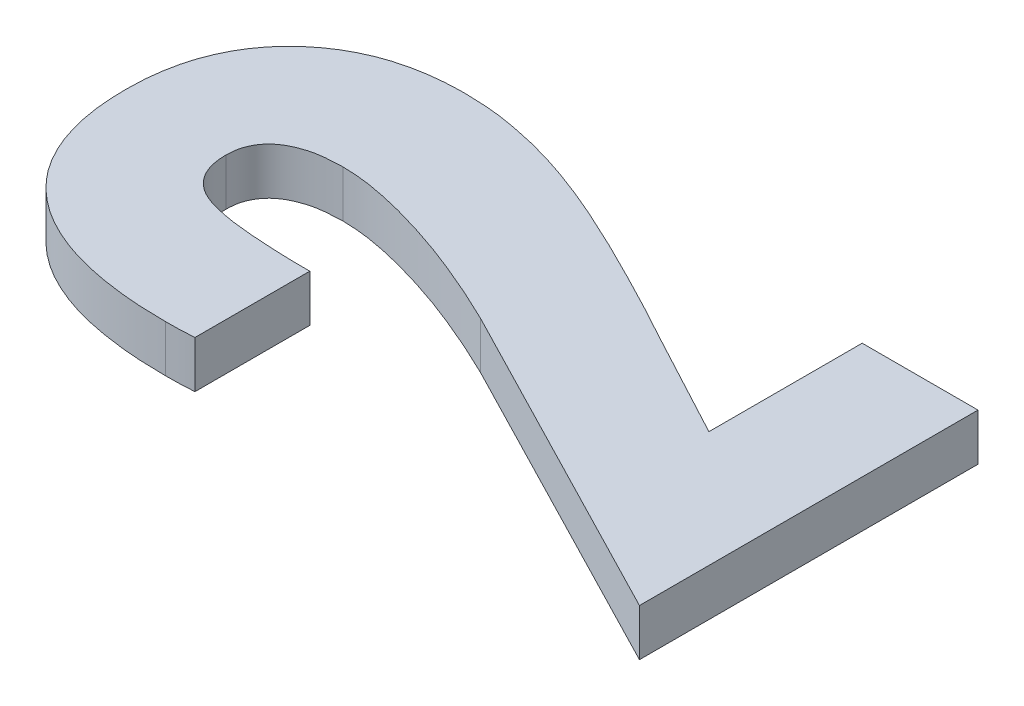
ISO-10303-21;
HEADER;
FILE_DESCRIPTION(('STEP AP214'),'2;1');
FILE_NAME('part.step','',(''),(''),'','','');
FILE_SCHEMA(('AUTOMOTIVE_DESIGN { 1 0 10303 214 1 1 1 1 }'));
ENDSEC;
DATA;
#1=APPLICATION_CONTEXT('core data for automotive mechanical design processes');
#2=APPLICATION_PROTOCOL_DEFINITION('international standard','automotive_design',2000,#1);
#3=PRODUCT_CONTEXT('',#1,'mechanical');
#4=PRODUCT('Part','Part','',(#3));
#5=PRODUCT_RELATED_PRODUCT_CATEGORY('part','',(#4));
#6=PRODUCT_DEFINITION_FORMATION('','',#4);
#7=PRODUCT_DEFINITION_CONTEXT('part definition',#1,'design');
#8=PRODUCT_DEFINITION('design','',#6,#7);
#9=PRODUCT_DEFINITION_SHAPE('','',#8);
#10=(LENGTH_UNIT() NAMED_UNIT(*) SI_UNIT(.MILLI.,.METRE.));
#11=(NAMED_UNIT(*) PLANE_ANGLE_UNIT() SI_UNIT($,.RADIAN.));
#12=(NAMED_UNIT(*) SI_UNIT($,.STERADIAN.) SOLID_ANGLE_UNIT());
#13=UNCERTAINTY_MEASURE_WITH_UNIT(LENGTH_MEASURE(1.E-05),#10,'distance_accuracy_value','');
#14=(GEOMETRIC_REPRESENTATION_CONTEXT(3) GLOBAL_UNCERTAINTY_ASSIGNED_CONTEXT((#13)) GLOBAL_UNIT_ASSIGNED_CONTEXT((#10,
#11,#12)) REPRESENTATION_CONTEXT('',''));
#15=CARTESIAN_POINT('',(0.,0.,0.));
#16=DIRECTION('',(0.,0.,1.));
#17=DIRECTION('',(1.,0.,0.));
#18=AXIS2_PLACEMENT_3D('',#15,#16,#17);
#19=CARTESIAN_POINT('',(2.55,2.9956,2.4466233766234));
#20=DIRECTION('',(1.,0.,0.));
#21=DIRECTION('',(0.,-1.,0.));
#22=AXIS2_PLACEMENT_3D('',#19,#20,#21);
#23=PLANE('',#22);
#24=DIRECTION('',(0.,0.,1.));
#25=VECTOR('',#24,1.);
#26=CARTESIAN_POINT('',(2.55,2.9306,2.4466233766234));
#27=LINE('',#26,#25);
#28=CARTESIAN_POINT('',(2.55,2.9306,2.4466233766234));
#29=VERTEX_POINT('',#28);
#30=CARTESIAN_POINT('',(2.55,2.9306,2.9154545454545));
#31=VERTEX_POINT('',#30);
#32=EDGE_CURVE('E11',#29,#31,#27,.T.);
#33=ORIENTED_EDGE('',*,*,#32,.F.);
#34=DIRECTION('',(0.,-1.,0.));
#35=VECTOR('',#34,1.);
#36=CARTESIAN_POINT('',(2.55,2.9956,2.4466233766234));
#37=LINE('',#36,#35);
#38=CARTESIAN_POINT('',(2.55,2.9956,2.4466233766234));
#39=VERTEX_POINT('',#38);
#40=EDGE_CURVE('E24',#39,#29,#37,.T.);
#41=ORIENTED_EDGE('',*,*,#40,.F.);
#42=DIRECTION('',(0.,0.,1.));
#43=VECTOR('',#42,1.);
#44=CARTESIAN_POINT('',(2.55,2.9956,2.4466233766234));
#45=LINE('',#44,#43);
#46=CARTESIAN_POINT('',(2.55,2.9956,2.9154545454545));
#47=VERTEX_POINT('',#46);
#48=EDGE_CURVE('E294',#39,#47,#45,.T.);
#49=ORIENTED_EDGE('',*,*,#48,.T.);
#50=DIRECTION('',(0.,-1.,0.));
#51=VECTOR('',#50,1.);
#52=CARTESIAN_POINT('',(2.55,2.9956,2.9154545454545));
#53=LINE('',#52,#51);
#54=EDGE_CURVE('E132',#47,#31,#53,.T.);
#55=ORIENTED_EDGE('',*,*,#54,.T.);
#56=EDGE_LOOP('',(#33,#41,#49,#55));
#57=FACE_BOUND('',#56,.T.);
#58=ADVANCED_FACE('F17',(#57),#23,.T.);
#59=CARTESIAN_POINT('',(2.3896103896104,2.9956,2.4466233766234));
#60=DIRECTION('',(0.,0.,-1.));
#61=DIRECTION('',(0.,1.,0.));
#62=AXIS2_PLACEMENT_3D('',#59,#60,#61);
#63=PLANE('',#62);
#64=DIRECTION('',(1.,0.,0.));
#65=VECTOR('',#64,1.);
#66=CARTESIAN_POINT('',(2.3896103896104,2.9306,2.4466233766234));
#67=LINE('',#66,#65);
#68=CARTESIAN_POINT('',(2.3896103896104,2.9306,2.4466233766234));
#69=VERTEX_POINT('',#68);
#70=EDGE_CURVE('E291',#69,#29,#67,.T.);
#71=ORIENTED_EDGE('',*,*,#70,.F.);
#72=DIRECTION('',(0.,-1.,0.));
#73=VECTOR('',#72,1.);
#74=CARTESIAN_POINT('',(2.3896103896104,2.9956,2.4466233766234));
#75=LINE('',#74,#73);
#76=CARTESIAN_POINT('',(2.3896103896104,2.9956,2.4466233766234));
#77=VERTEX_POINT('',#76);
#78=EDGE_CURVE('E288',#77,#69,#75,.T.);
#79=ORIENTED_EDGE('',*,*,#78,.F.);
#80=DIRECTION('',(1.,0.,0.));
#81=VECTOR('',#80,1.);
#82=CARTESIAN_POINT('',(2.3896103896104,2.9956,2.4466233766234));
#83=LINE('',#82,#81);
#84=EDGE_CURVE('E285',#77,#39,#83,.T.);
#85=ORIENTED_EDGE('',*,*,#84,.T.);
#86=ORIENTED_EDGE('',*,*,#40,.T.);
#87=EDGE_LOOP('',(#71,#79,#85,#86));
#88=FACE_BOUND('',#87,.T.);
#89=ADVANCED_FACE('F296',(#88),#63,.T.);
#90=CARTESIAN_POINT('',(2.3896103896104,2.9956,2.658869724026));
#91=DIRECTION('',(-1.,0.,0.));
#92=DIRECTION('',(0.,1.,0.));
#93=AXIS2_PLACEMENT_3D('',#90,#91,#92);
#94=PLANE('',#93);
#95=DIRECTION('',(0.,0.,-1.));
#96=VECTOR('',#95,1.);
#97=CARTESIAN_POINT('',(2.3896103896104,2.9306,2.658869724026));
#98=LINE('',#97,#96);
#99=CARTESIAN_POINT('',(2.3896103896104,2.9306,2.658869724026));
#100=VERTEX_POINT('',#99);
#101=EDGE_CURVE('E282',#100,#69,#98,.T.);
#102=ORIENTED_EDGE('',*,*,#101,.F.);
#103=DIRECTION('',(0.,-1.,0.));
#104=VECTOR('',#103,1.);
#105=CARTESIAN_POINT('',(2.3896103896104,2.9956,2.658869724026));
#106=LINE('',#105,#104);
#107=CARTESIAN_POINT('',(2.3896103896104,2.9956,2.658869724026));
#108=VERTEX_POINT('',#107);
#109=EDGE_CURVE('E279',#108,#100,#106,.T.);
#110=ORIENTED_EDGE('',*,*,#109,.F.);
#111=DIRECTION('',(0.,0.,-1.));
#112=VECTOR('',#111,1.);
#113=CARTESIAN_POINT('',(2.3896103896104,2.9956,2.658869724026));
#114=LINE('',#113,#112);
#115=EDGE_CURVE('E276',#108,#77,#114,.T.);
#116=ORIENTED_EDGE('',*,*,#115,.T.);
#117=ORIENTED_EDGE('',*,*,#78,.T.);
#118=EDGE_LOOP('',(#102,#110,#116,#117));
#119=FACE_BOUND('',#118,.T.);
#120=ADVANCED_FACE('F300',(#119),#94,.T.);
#121=CARTESIAN_POINT('',(2.2411728896104,2.9956,2.5794460227273));
#122=DIRECTION('',(0.471776481503363,0.,-0.88171818145046));
#123=DIRECTION('',(-0.88171818145046,0.,-0.471776481503363));
#124=AXIS2_PLACEMENT_3D('',#121,#122,#123);
#125=PLANE('',#124);
#126=DIRECTION('',(0.88171818145046,0.,0.471776481503363));
#127=VECTOR('',#126,1.);
#128=CARTESIAN_POINT('',(2.2411728896104,2.9306,2.5794460227273));
#129=LINE('',#128,#127);
#130=CARTESIAN_POINT('',(2.2411728896104,2.9306,2.5794460227273));
#131=VERTEX_POINT('',#130);
#132=EDGE_CURVE('E273',#131,#100,#129,.T.);
#133=ORIENTED_EDGE('',*,*,#132,.F.);
#134=DIRECTION('',(0.,-1.,0.));
#135=VECTOR('',#134,1.);
#136=CARTESIAN_POINT('',(2.2411728896104,2.9956,2.5794460227273));
#137=LINE('',#136,#135);
#138=CARTESIAN_POINT('',(2.2411728896104,2.9956,2.5794460227273));
#139=VERTEX_POINT('',#138);
#140=EDGE_CURVE('E270',#139,#131,#137,.T.);
#141=ORIENTED_EDGE('',*,*,#140,.F.);
#142=DIRECTION('',(0.88171818145046,0.,0.471776481503363));
#143=VECTOR('',#142,1.);
#144=CARTESIAN_POINT('',(2.2411728896104,2.9956,2.5794460227273));
#145=LINE('',#144,#143);
#146=EDGE_CURVE('E264',#139,#108,#145,.T.);
#147=ORIENTED_EDGE('',*,*,#146,.T.);
#148=ORIENTED_EDGE('',*,*,#109,.T.);
#149=EDGE_LOOP('',(#133,#141,#147,#148));
#150=FACE_BOUND('',#149,.T.);
#151=ADVANCED_FACE('F303',(#150),#125,.T.);
#152=CARTESIAN_POINT('',(1.815137987013,2.9956,2.4219480519481));
#153=CARTESIAN_POINT('',(1.815137987013,2.9306,2.4219480519481));
#154=CARTESIAN_POINT('',(1.8280140387404,2.9956,2.4223085834457));
#155=CARTESIAN_POINT('',(1.8280140387404,2.9306,2.4223085834457));
#156=CARTESIAN_POINT('',(1.8545489463179,2.9956,2.423051565081));
#157=CARTESIAN_POINT('',(1.8545489463179,2.9306,2.423051565081));
#158=CARTESIAN_POINT('',(1.8951400305445,2.9956,2.4297636555094));
#159=CARTESIAN_POINT('',(1.8951400305445,2.9306,2.4297636555094));
#160=CARTESIAN_POINT('',(1.9377170777586,2.9956,2.4397144743967));
#161=CARTESIAN_POINT('',(1.9377170777586,2.9306,2.4397144743967));
#162=CARTESIAN_POINT('',(1.9744361030969,2.9956,2.4516947987664));
#163=CARTESIAN_POINT('',(1.9744361030969,2.9306,2.4516947987664));
#164=CARTESIAN_POINT('',(2.0057829344742,2.9956,2.46367110546));
#165=CARTESIAN_POINT('',(2.0057829344742,2.9306,2.46367110546));
#166=CARTESIAN_POINT('',(2.0322801080516,2.9956,2.4744195268402));
#167=CARTESIAN_POINT('',(2.0322801080516,2.9306,2.4744195268402));
#168=CARTESIAN_POINT('',(2.0610420074567,2.9956,2.4874367367209));
#169=CARTESIAN_POINT('',(2.0610420074567,2.9306,2.4874367367209));
#170=CARTESIAN_POINT('',(2.0923666821898,2.9956,2.5020961937868));
#171=CARTESIAN_POINT('',(2.0923666821898,2.9306,2.5020961937868));
#172=CARTESIAN_POINT('',(2.1260967230946,2.9956,2.5187016691765));
#173=CARTESIAN_POINT('',(2.1260967230946,2.9306,2.5187016691765));
#174=CARTESIAN_POINT('',(2.1622698522993,2.9956,2.5372828202527));
#175=CARTESIAN_POINT('',(2.1622698522993,2.9306,2.5372828202527));
#176=CARTESIAN_POINT('',(2.2010943975891,2.9956,2.5573944884237));
#177=CARTESIAN_POINT('',(2.2010943975891,2.9306,2.5573944884237));
#178=CARTESIAN_POINT('',(2.2275175139791,2.9956,2.5719327164881));
#179=CARTESIAN_POINT('',(2.2275175139791,2.9306,2.5719327164881));
#180=CARTESIAN_POINT('',(2.2411728896104,2.9956,2.5794460227273));
#181=CARTESIAN_POINT('',(2.2411728896104,2.9306,2.5794460227273));
#182=B_SPLINE_SURFACE_WITH_KNOTS('',3,1,((#152,#153),(#154,#155),(#156,#157),(#158,#159),(#160,
#161),(#162,#163),(#164,#165),(#166,#167),(#168,#169),(#170,#171),(#172,#173),(#174,#175),(#176,
#177),(#178,#179),(#180,#181)),.UNSPECIFIED.,.F.,.F.,.F.,(4,1,1,1,1,1,1,1,1,1,1,1,4),(2,2),(0.,
0.0841535323354009,0.173423208458468,0.268424084711057,0.369959448801613,0.425687178443032,
0.487884515726795,0.556923367619781,0.632122153306125,0.714065166825065,0.802775202710945,
0.898074903389879,1.),(0.,1.),.UNSPECIFIED.);
#183=CARTESIAN_POINT('',(1.815137987013,2.9306,2.4219480519481));
#184=CARTESIAN_POINT('',(1.8280140387404,2.9306,2.4223085834457));
#185=CARTESIAN_POINT('',(1.8545489463179,2.9306,2.423051565081));
#186=CARTESIAN_POINT('',(1.8951400305445,2.9306,2.4297636555094));
#187=CARTESIAN_POINT('',(1.9377170777586,2.9306,2.4397144743967));
#188=CARTESIAN_POINT('',(1.9744361030969,2.9306,2.4516947987664));
#189=CARTESIAN_POINT('',(2.0057829344742,2.9306,2.46367110546));
#190=CARTESIAN_POINT('',(2.0322801080516,2.9306,2.4744195268402));
#191=CARTESIAN_POINT('',(2.0610420074567,2.9306,2.4874367367209));
#192=CARTESIAN_POINT('',(2.0923666821898,2.9306,2.5020961937868));
#193=CARTESIAN_POINT('',(2.1260967230946,2.9306,2.5187016691765));
#194=CARTESIAN_POINT('',(2.1622698522993,2.9306,2.5372828202527));
#195=CARTESIAN_POINT('',(2.2010943975891,2.9306,2.5573944884237));
#196=CARTESIAN_POINT('',(2.2275175139791,2.9306,2.5719327164881));
#197=CARTESIAN_POINT('',(2.2411728896104,2.9306,2.5794460227273));
#198=B_SPLINE_CURVE_WITH_KNOTS('',3,(#183,#184,#185,#186,#187,#188,#189,#190,#191,#192,#193,
#194,#195,#196,#197),.UNSPECIFIED.,.F.,.F.,(4,1,1,1,1,1,1,1,1,1,1,1,4),(0.,0.0841535323354009,
0.173423208458468,0.268424084711057,0.369959448801613,0.425687178443032,0.487884515726795,
0.556923367619781,0.632122153306125,0.714065166825065,0.802775202710945,0.898074903389879,1.),.UNSPECIFIED.);
#199=CARTESIAN_POINT('',(1.815137987013,2.9306,2.4219480519481));
#200=VERTEX_POINT('',#199);
#201=EDGE_CURVE('E259',#200,#131,#198,.T.);
#202=DIRECTION('',(0.,-1.,0.));
#203=VECTOR('',#202,1.);
#204=CARTESIAN_POINT('',(1.815137987013,2.9956,2.4219480519481));
#205=LINE('',#204,#203);
#206=CARTESIAN_POINT('',(1.815137987013,2.9956,2.4219480519481));
#207=VERTEX_POINT('',#206);
#208=EDGE_CURVE('E253',#207,#200,#205,.T.);
#209=CARTESIAN_POINT('',(1.815137987013,2.9956,2.4219480519481));
#210=CARTESIAN_POINT('',(1.8280140387404,2.9956,2.4223085834457));
#211=CARTESIAN_POINT('',(1.8545489463179,2.9956,2.423051565081));
#212=CARTESIAN_POINT('',(1.8951400305445,2.9956,2.4297636555094));
#213=CARTESIAN_POINT('',(1.9377170777586,2.9956,2.4397144743967));
#214=CARTESIAN_POINT('',(1.9744361030969,2.9956,2.4516947987664));
#215=CARTESIAN_POINT('',(2.0057829344742,2.9956,2.46367110546));
#216=CARTESIAN_POINT('',(2.0322801080516,2.9956,2.4744195268402));
#217=CARTESIAN_POINT('',(2.0610420074567,2.9956,2.4874367367209));
#218=CARTESIAN_POINT('',(2.0923666821898,2.9956,2.5020961937868));
#219=CARTESIAN_POINT('',(2.1260967230946,2.9956,2.5187016691765));
#220=CARTESIAN_POINT('',(2.1622698522993,2.9956,2.5372828202527));
#221=CARTESIAN_POINT('',(2.2010943975891,2.9956,2.5573944884237));
#222=CARTESIAN_POINT('',(2.2275175139791,2.9956,2.5719327164881));
#223=CARTESIAN_POINT('',(2.2411728896104,2.9956,2.5794460227273));
#224=B_SPLINE_CURVE_WITH_KNOTS('',3,(#209,#210,#211,#212,#213,#214,#215,#216,#217,#218,#219,
#220,#221,#222,#223),.UNSPECIFIED.,.F.,.F.,(4,1,1,1,1,1,1,1,1,1,1,1,4),(0.,0.0841535323354009,
0.173423208458468,0.268424084711057,0.369959448801613,0.425687178443032,0.487884515726795,
0.556923367619781,0.632122153306125,0.714065166825065,0.802775202710945,0.898074903389879,1.),.UNSPECIFIED.);
#225=EDGE_CURVE('E245',#207,#139,#224,.T.);
#226=ORIENTED_EDGE('',*,*,#201,.F.);
#227=ORIENTED_EDGE('',*,*,#208,.F.);
#228=ORIENTED_EDGE('',*,*,#225,.T.);
#229=ORIENTED_EDGE('',*,*,#140,.T.);
#230=EDGE_LOOP('',(#226,#227,#228,#229));
#231=FACE_BOUND('',#230,.T.);
#232=ADVANCED_FACE('F308',(#231),#182,.T.);
#233=CARTESIAN_POINT('',(1.5753246753247,2.9956,2.651737012987));
#234=CARTESIAN_POINT('',(1.5753246753247,2.9306,2.651737012987));
#235=CARTESIAN_POINT('',(1.5754767160002,2.9956,2.6431149631171));
#236=CARTESIAN_POINT('',(1.5754767160002,2.9306,2.6431149631171));
#237=CARTESIAN_POINT('',(1.5757727681102,2.9956,2.6263261922921));
#238=CARTESIAN_POINT('',(1.5757727681102,2.9306,2.6263261922921));
#239=CARTESIAN_POINT('',(1.5790385454388,2.9956,2.6018329970535));
#240=CARTESIAN_POINT('',(1.5790385454388,2.9306,2.6018329970535));
#241=CARTESIAN_POINT('',(1.5838665891994,2.9956,2.5786655962364));
#242=CARTESIAN_POINT('',(1.5838665891994,2.9306,2.5786655962364));
#243=CARTESIAN_POINT('',(1.5911231227219,2.9956,2.5569392287587));
#244=CARTESIAN_POINT('',(1.5911231227219,2.9306,2.5569392287587));
#245=CARTESIAN_POINT('',(1.6001456439086,2.9956,2.5365117809013));
#246=CARTESIAN_POINT('',(1.6001456439086,2.9306,2.5365117809013));
#247=CARTESIAN_POINT('',(1.6114393844046,2.9956,2.5175635955669));
#248=CARTESIAN_POINT('',(1.6114393844046,2.9306,2.5175635955669));
#249=CARTESIAN_POINT('',(1.6246111006042,2.9956,2.4998596277387));
#250=CARTESIAN_POINT('',(1.6246111006042,2.9306,2.4998596277387));
#251=CARTESIAN_POINT('',(1.639822753678,2.9956,2.4836973602856));
#252=CARTESIAN_POINT('',(1.639822753678,2.9306,2.4836973602856));
#253=CARTESIAN_POINT('',(1.6568622751586,2.9956,2.4693034324471));
#254=CARTESIAN_POINT('',(1.6568622751586,2.9306,2.4693034324471));
#255=CARTESIAN_POINT('',(1.6751430046056,2.9956,2.4564363152045));
#256=CARTESIAN_POINT('',(1.6751430046056,2.9306,2.4564363152045));
#257=CARTESIAN_POINT('',(1.6950906739051,2.9956,2.4458425147271));
#258=CARTESIAN_POINT('',(1.6950906739051,2.9306,2.4458425147271));
#259=CARTESIAN_POINT('',(1.7162694599253,2.9956,2.4368942390099));
#260=CARTESIAN_POINT('',(1.7162694599253,2.9306,2.4368942390099));
#261=CARTESIAN_POINT('',(1.7390491100072,2.9956,2.4301819416341));
#262=CARTESIAN_POINT('',(1.7390491100072,2.9306,2.4301819416341));
#263=CARTESIAN_POINT('',(1.7631830684132,2.9956,2.4254211537877));
#264=CARTESIAN_POINT('',(1.7631830684132,2.9306,2.4254211537877));
#265=CARTESIAN_POINT('',(1.7887188613873,2.9956,2.4224680546979));
#266=CARTESIAN_POINT('',(1.7887188613873,2.9306,2.4224680546979));
#267=CARTESIAN_POINT('',(1.8061979110027,2.9956,2.4221240178061));
#268=CARTESIAN_POINT('',(1.8061979110027,2.9306,2.4221240178061));
#269=CARTESIAN_POINT('',(1.815137987013,2.9956,2.4219480519481));
#270=CARTESIAN_POINT('',(1.815137987013,2.9306,2.4219480519481));
#271=B_SPLINE_SURFACE_WITH_KNOTS('',3,1,((#233,#234),(#235,#236),(#237,#238),(#239,#240),(#241,
#242),(#243,#244),(#245,#246),(#247,#248),(#249,#250),(#251,#252),(#253,#254),(#255,#256),(#257,
#258),(#259,#260),(#261,#262),(#263,#264),(#265,#266),(#267,#268),(#269,#270)),.UNSPECIFIED.,
.F.,.F.,.F.,(4,1,1,1,1,1,1,1,1,1,1,1,1,1,1,1,4),(2,2),(0.,0.0688496335754191,0.134063330289372,
0.197106461741571,0.257669144546347,0.316735514046816,0.37520526091284,0.433532808566138,
0.492739602849354,0.552106475877159,0.611499986749421,0.670999929743259,0.732218533488547,
0.794922033348914,0.860373803317353,0.928584857938967,1.),(0.,1.),.UNSPECIFIED.);
#272=CARTESIAN_POINT('',(1.5753246753247,2.9306,2.651737012987));
#273=CARTESIAN_POINT('',(1.5754767160002,2.9306,2.6431149631171));
#274=CARTESIAN_POINT('',(1.5757727681102,2.9306,2.6263261922921));
#275=CARTESIAN_POINT('',(1.5790385454388,2.9306,2.6018329970535));
#276=CARTESIAN_POINT('',(1.5838665891994,2.9306,2.5786655962364));
#277=CARTESIAN_POINT('',(1.5911231227219,2.9306,2.5569392287587));
#278=CARTESIAN_POINT('',(1.6001456439086,2.9306,2.5365117809013));
#279=CARTESIAN_POINT('',(1.6114393844046,2.9306,2.5175635955669));
#280=CARTESIAN_POINT('',(1.6246111006042,2.9306,2.4998596277387));
#281=CARTESIAN_POINT('',(1.639822753678,2.9306,2.4836973602856));
#282=CARTESIAN_POINT('',(1.6568622751586,2.9306,2.4693034324471));
#283=CARTESIAN_POINT('',(1.6751430046056,2.9306,2.4564363152045));
#284=CARTESIAN_POINT('',(1.6950906739051,2.9306,2.4458425147271));
#285=CARTESIAN_POINT('',(1.7162694599253,2.9306,2.4368942390099));
#286=CARTESIAN_POINT('',(1.7390491100072,2.9306,2.4301819416341));
#287=CARTESIAN_POINT('',(1.7631830684132,2.9306,2.4254211537877));
#288=CARTESIAN_POINT('',(1.7887188613873,2.9306,2.4224680546979));
#289=CARTESIAN_POINT('',(1.8061979110027,2.9306,2.4221240178061));
#290=CARTESIAN_POINT('',(1.815137987013,2.9306,2.4219480519481));
#291=B_SPLINE_CURVE_WITH_KNOTS('',3,(#272,#273,#274,#275,#276,#277,#278,#279,#280,#281,#282,
#283,#284,#285,#286,#287,#288,#289,#290),.UNSPECIFIED.,.F.,.F.,(4,1,1,1,1,1,1,1,1,1,1,1,1,1,1,1,
4),(0.,0.0688496335754191,0.134063330289372,0.197106461741571,0.257669144546347,
0.316735514046816,0.37520526091284,0.433532808566138,0.492739602849354,0.552106475877159,
0.611499986749421,0.670999929743259,0.732218533488547,0.794922033348914,0.860373803317353,
0.928584857938967,1.),.UNSPECIFIED.);
#292=CARTESIAN_POINT('',(1.5753246753247,2.9306,2.651737012987));
#293=VERTEX_POINT('',#292);
#294=EDGE_CURVE('E240',#293,#200,#291,.T.);
#295=DIRECTION('',(0.,-1.,0.));
#296=VECTOR('',#295,1.);
#297=CARTESIAN_POINT('',(1.5753246753247,2.9956,2.651737012987));
#298=LINE('',#297,#296);
#299=CARTESIAN_POINT('',(1.5753246753247,2.9956,2.651737012987));
#300=VERTEX_POINT('',#299);
#301=EDGE_CURVE('E234',#300,#293,#298,.T.);
#302=CARTESIAN_POINT('',(1.5753246753247,2.9956,2.651737012987));
#303=CARTESIAN_POINT('',(1.5754767160002,2.9956,2.6431149631171));
#304=CARTESIAN_POINT('',(1.5757727681102,2.9956,2.6263261922921));
#305=CARTESIAN_POINT('',(1.5790385454388,2.9956,2.6018329970535));
#306=CARTESIAN_POINT('',(1.5838665891994,2.9956,2.5786655962364));
#307=CARTESIAN_POINT('',(1.5911231227219,2.9956,2.5569392287587));
#308=CARTESIAN_POINT('',(1.6001456439086,2.9956,2.5365117809013));
#309=CARTESIAN_POINT('',(1.6114393844046,2.9956,2.5175635955669));
#310=CARTESIAN_POINT('',(1.6246111006042,2.9956,2.4998596277387));
#311=CARTESIAN_POINT('',(1.639822753678,2.9956,2.4836973602856));
#312=CARTESIAN_POINT('',(1.6568622751586,2.9956,2.4693034324471));
#313=CARTESIAN_POINT('',(1.6751430046056,2.9956,2.4564363152045));
#314=CARTESIAN_POINT('',(1.6950906739051,2.9956,2.4458425147271));
#315=CARTESIAN_POINT('',(1.7162694599253,2.9956,2.4368942390099));
#316=CARTESIAN_POINT('',(1.7390491100072,2.9956,2.4301819416341));
#317=CARTESIAN_POINT('',(1.7631830684132,2.9956,2.4254211537877));
#318=CARTESIAN_POINT('',(1.7887188613873,2.9956,2.4224680546979));
#319=CARTESIAN_POINT('',(1.8061979110027,2.9956,2.4221240178061));
#320=CARTESIAN_POINT('',(1.815137987013,2.9956,2.4219480519481));
#321=B_SPLINE_CURVE_WITH_KNOTS('',3,(#302,#303,#304,#305,#306,#307,#308,#309,#310,#311,#312,
#313,#314,#315,#316,#317,#318,#319,#320),.UNSPECIFIED.,.F.,.F.,(4,1,1,1,1,1,1,1,1,1,1,1,1,1,1,1,
4),(0.,0.0688496335754191,0.134063330289372,0.197106461741571,0.257669144546347,
0.316735514046816,0.37520526091284,0.433532808566138,0.492739602849354,0.552106475877159,
0.611499986749421,0.670999929743259,0.732218533488547,0.794922033348914,0.860373803317353,
0.928584857938967,1.),.UNSPECIFIED.);
#322=EDGE_CURVE('E226',#300,#207,#321,.T.);
#323=ORIENTED_EDGE('',*,*,#294,.F.);
#324=ORIENTED_EDGE('',*,*,#301,.F.);
#325=ORIENTED_EDGE('',*,*,#322,.T.);
#326=ORIENTED_EDGE('',*,*,#208,.T.);
#327=EDGE_LOOP('',(#323,#324,#325,#326));
#328=FACE_BOUND('',#327,.T.);
#329=ADVANCED_FACE('F310',(#328),#271,.T.);
#330=CARTESIAN_POINT('',(1.8812601461039,2.9956,2.9031168831169));
#331=CARTESIAN_POINT('',(1.8812601461039,2.9306,2.9031168831169));
#332=CARTESIAN_POINT('',(1.8691079834718,2.9956,2.9029617455148));
#333=CARTESIAN_POINT('',(1.8691079834718,2.9306,2.9029617455148));
#334=CARTESIAN_POINT('',(1.845532817911,2.9956,2.902660778949));
#335=CARTESIAN_POINT('',(1.845532817911,2.9306,2.902660778949));
#336=CARTESIAN_POINT('',(1.8113410417312,2.9956,2.8994923796882));
#337=CARTESIAN_POINT('',(1.8113410417312,2.9306,2.8994923796882));
#338=CARTESIAN_POINT('',(1.7793902501637,2.9956,2.894529266419));
#339=CARTESIAN_POINT('',(1.7793902501637,2.9306,2.894529266419));
#340=CARTESIAN_POINT('',(1.7496164763615,2.9956,2.8877125692327));
#341=CARTESIAN_POINT('',(1.7496164763615,2.9306,2.8877125692327));
#342=CARTESIAN_POINT('',(1.7221349606599,2.9956,2.8786394693431));
#343=CARTESIAN_POINT('',(1.7221349606599,2.9306,2.8786394693431));
#344=CARTESIAN_POINT('',(1.6968969235994,2.9956,2.8676059626757));
#345=CARTESIAN_POINT('',(1.6968969235994,2.9306,2.8676059626757));
#346=CARTESIAN_POINT('',(1.6737722742615,2.9956,2.8547458392355));
#347=CARTESIAN_POINT('',(1.6737722742615,2.9306,2.8547458392355));
#348=CARTESIAN_POINT('',(1.6530415117925,2.9956,2.839608320558));
#349=CARTESIAN_POINT('',(1.6530415117925,2.9306,2.839608320558));
#350=CARTESIAN_POINT('',(1.6346458607338,2.9956,2.8226128305528));
#351=CARTESIAN_POINT('',(1.6346458607338,2.9306,2.8226128305528));
#352=CARTESIAN_POINT('',(1.6186275106082,2.9956,2.8037643638593));
#353=CARTESIAN_POINT('',(1.6186275106082,2.9306,2.8037643638593));
#354=CARTESIAN_POINT('',(1.6052772996688,2.9956,2.7828987075812));
#355=CARTESIAN_POINT('',(1.6052772996688,2.9306,2.7828987075812));
#356=CARTESIAN_POINT('',(1.59423533543,2.9956,2.7602707633692));
#357=CARTESIAN_POINT('',(1.59423533543,2.9306,2.7602707633692));
#358=CARTESIAN_POINT('',(1.5857687040258,2.9956,2.7357152037606));
#359=CARTESIAN_POINT('',(1.5857687040258,2.9306,2.7357152037606));
#360=CARTESIAN_POINT('',(1.5796059607806,2.9956,2.7093730989925));
#361=CARTESIAN_POINT('',(1.5796059607806,2.9306,2.7093730989925));
#362=CARTESIAN_POINT('',(1.5759065503809,2.9956,2.681144345751));
#363=CARTESIAN_POINT('',(1.5759065503809,2.9306,2.681144345751));
#364=CARTESIAN_POINT('',(1.5755219768012,2.9956,2.6617084151191));
#365=CARTESIAN_POINT('',(1.5755219768012,2.9306,2.6617084151191));
#366=CARTESIAN_POINT('',(1.5753246753247,2.9956,2.651737012987));
#367=CARTESIAN_POINT('',(1.5753246753247,2.9306,2.651737012987));
#368=B_SPLINE_SURFACE_WITH_KNOTS('',3,1,((#330,#331),(#332,#333),(#334,#335),(#336,#337),(#338,
#339),(#340,#341),(#342,#343),(#344,#345),(#346,#347),(#348,#349),(#350,#351),(#352,#353),(#354,
#355),(#356,#357),(#358,#359),(#360,#361),(#362,#363),(#364,#365),(#366,#367)),.UNSPECIFIED.,
.F.,.F.,.F.,(4,1,1,1,1,1,1,1,1,1,1,1,1,1,1,1,4),(2,2),(0.,0.0807293757774602,0.156614790075106,
0.227937486450869,0.295466760171889,0.359334269516533,0.419944316034082,0.478256228725499,
0.534794950441015,0.590088115624268,0.644322590041806,0.698686336246697,0.754257428526104,
0.811244220857325,0.870900721613007,0.933766957490013,1.),(0.,1.),.UNSPECIFIED.);
#369=CARTESIAN_POINT('',(1.8812601461039,2.9306,2.9031168831169));
#370=CARTESIAN_POINT('',(1.8691079834718,2.9306,2.9029617455148));
#371=CARTESIAN_POINT('',(1.845532817911,2.9306,2.902660778949));
#372=CARTESIAN_POINT('',(1.8113410417312,2.9306,2.8994923796882));
#373=CARTESIAN_POINT('',(1.7793902501637,2.9306,2.894529266419));
#374=CARTESIAN_POINT('',(1.7496164763615,2.9306,2.8877125692327));
#375=CARTESIAN_POINT('',(1.7221349606599,2.9306,2.8786394693431));
#376=CARTESIAN_POINT('',(1.6968969235994,2.9306,2.8676059626757));
#377=CARTESIAN_POINT('',(1.6737722742615,2.9306,2.8547458392355));
#378=CARTESIAN_POINT('',(1.6530415117925,2.9306,2.839608320558));
#379=CARTESIAN_POINT('',(1.6346458607338,2.9306,2.8226128305528));
#380=CARTESIAN_POINT('',(1.6186275106082,2.9306,2.8037643638593));
#381=CARTESIAN_POINT('',(1.6052772996688,2.9306,2.7828987075812));
#382=CARTESIAN_POINT('',(1.59423533543,2.9306,2.7602707633692));
#383=CARTESIAN_POINT('',(1.5857687040258,2.9306,2.7357152037606));
#384=CARTESIAN_POINT('',(1.5796059607806,2.9306,2.7093730989925));
#385=CARTESIAN_POINT('',(1.5759065503809,2.9306,2.681144345751));
#386=CARTESIAN_POINT('',(1.5755219768012,2.9306,2.6617084151191));
#387=CARTESIAN_POINT('',(1.5753246753247,2.9306,2.651737012987));
#388=B_SPLINE_CURVE_WITH_KNOTS('',3,(#369,#370,#371,#372,#373,#374,#375,#376,#377,#378,#379,
#380,#381,#382,#383,#384,#385,#386,#387),.UNSPECIFIED.,.F.,.F.,(4,1,1,1,1,1,1,1,1,1,1,1,1,1,1,1,
4),(0.,0.0807293757774602,0.156614790075106,0.227937486450869,0.295466760171889,
0.359334269516533,0.419944316034082,0.478256228725499,0.534794950441015,0.590088115624268,
0.644322590041806,0.698686336246697,0.754257428526104,0.811244220857325,0.870900721613007,
0.933766957490013,1.),.UNSPECIFIED.);
#389=CARTESIAN_POINT('',(1.8812601461039,2.9306,2.9031168831169));
#390=VERTEX_POINT('',#389);
#391=EDGE_CURVE('E221',#390,#293,#388,.T.);
#392=DIRECTION('',(0.,-1.,0.));
#393=VECTOR('',#392,1.);
#394=CARTESIAN_POINT('',(1.8812601461039,2.9956,2.9031168831169));
#395=LINE('',#394,#393);
#396=CARTESIAN_POINT('',(1.8812601461039,2.9956,2.9031168831169));
#397=VERTEX_POINT('',#396);
#398=EDGE_CURVE('E215',#397,#390,#395,.T.);
#399=CARTESIAN_POINT('',(1.8812601461039,2.9956,2.9031168831169));
#400=CARTESIAN_POINT('',(1.8691079834718,2.9956,2.9029617455148));
#401=CARTESIAN_POINT('',(1.845532817911,2.9956,2.902660778949));
#402=CARTESIAN_POINT('',(1.8113410417312,2.9956,2.8994923796882));
#403=CARTESIAN_POINT('',(1.7793902501637,2.9956,2.894529266419));
#404=CARTESIAN_POINT('',(1.7496164763615,2.9956,2.8877125692327));
#405=CARTESIAN_POINT('',(1.7221349606599,2.9956,2.8786394693431));
#406=CARTESIAN_POINT('',(1.6968969235994,2.9956,2.8676059626757));
#407=CARTESIAN_POINT('',(1.6737722742615,2.9956,2.8547458392355));
#408=CARTESIAN_POINT('',(1.6530415117925,2.9956,2.839608320558));
#409=CARTESIAN_POINT('',(1.6346458607338,2.9956,2.8226128305528));
#410=CARTESIAN_POINT('',(1.6186275106082,2.9956,2.8037643638593));
#411=CARTESIAN_POINT('',(1.6052772996688,2.9956,2.7828987075812));
#412=CARTESIAN_POINT('',(1.59423533543,2.9956,2.7602707633692));
#413=CARTESIAN_POINT('',(1.5857687040258,2.9956,2.7357152037606));
#414=CARTESIAN_POINT('',(1.5796059607806,2.9956,2.7093730989925));
#415=CARTESIAN_POINT('',(1.5759065503809,2.9956,2.681144345751));
#416=CARTESIAN_POINT('',(1.5755219768012,2.9956,2.6617084151191));
#417=CARTESIAN_POINT('',(1.5753246753247,2.9956,2.651737012987));
#418=B_SPLINE_CURVE_WITH_KNOTS('',3,(#399,#400,#401,#402,#403,#404,#405,#406,#407,#408,#409,
#410,#411,#412,#413,#414,#415,#416,#417),.UNSPECIFIED.,.F.,.F.,(4,1,1,1,1,1,1,1,1,1,1,1,1,1,1,1,
4),(0.,0.0807293757774602,0.156614790075106,0.227937486450869,0.295466760171889,
0.359334269516533,0.419944316034082,0.478256228725499,0.534794950441015,0.590088115624268,
0.644322590041806,0.698686336246697,0.754257428526104,0.811244220857325,0.870900721613007,
0.933766957490013,1.),.UNSPECIFIED.);
#419=EDGE_CURVE('E207',#397,#300,#418,.T.);
#420=ORIENTED_EDGE('',*,*,#391,.F.);
#421=ORIENTED_EDGE('',*,*,#398,.F.);
#422=ORIENTED_EDGE('',*,*,#419,.T.);
#423=ORIENTED_EDGE('',*,*,#301,.T.);
#424=EDGE_LOOP('',(#420,#421,#422,#423));
#425=FACE_BOUND('',#424,.T.);
#426=ADVANCED_FACE('F312',(#425),#368,.T.);
#427=CARTESIAN_POINT('',(1.9207792207792,2.9956,2.9017674512987));
#428=CARTESIAN_POINT('',(1.9207792207792,2.9306,2.9017674512987));
#429=CARTESIAN_POINT('',(1.9184027950971,2.9956,2.9019761900101));
#430=CARTESIAN_POINT('',(1.9184027950971,2.9306,2.9019761900101));
#431=CARTESIAN_POINT('',(1.9133345819976,2.9956,2.9024213679425));
#432=CARTESIAN_POINT('',(1.9133345819976,2.9306,2.9024213679425));
#433=CARTESIAN_POINT('',(1.9048467528338,2.9956,2.902800965194));
#434=CARTESIAN_POINT('',(1.9048467528338,2.9306,2.902800965194));
#435=CARTESIAN_POINT('',(1.8940477864776,2.9956,2.902938867637));
#436=CARTESIAN_POINT('',(1.8940477864776,2.9306,2.902938867637));
#437=CARTESIAN_POINT('',(1.8859509844227,2.9956,2.9030515824195));
#438=CARTESIAN_POINT('',(1.8859509844227,2.9306,2.9030515824195));
#439=CARTESIAN_POINT('',(1.8812601461039,2.9956,2.9031168831169));
#440=CARTESIAN_POINT('',(1.8812601461039,2.9306,2.9031168831169));
#441=B_SPLINE_SURFACE_WITH_KNOTS('',3,1,((#427,#428),(#429,#430),(#431,#432),(#433,#434),(#435,
#436),(#437,#438),(#439,#440)),.UNSPECIFIED.,.F.,.F.,.F.,(4,1,1,1,4),(2,2),(0.,
0.180916581276161,0.385841557786642,0.644190640321808,1.),(0.,1.),.UNSPECIFIED.);
#442=CARTESIAN_POINT('',(1.9207792207792,2.9306,2.9017674512987));
#443=CARTESIAN_POINT('',(1.9184027950971,2.9306,2.9019761900101));
#444=CARTESIAN_POINT('',(1.9133345819976,2.9306,2.9024213679425));
#445=CARTESIAN_POINT('',(1.9048467528338,2.9306,2.902800965194));
#446=CARTESIAN_POINT('',(1.8940477864776,2.9306,2.902938867637));
#447=CARTESIAN_POINT('',(1.8859509844227,2.9306,2.9030515824195));
#448=CARTESIAN_POINT('',(1.8812601461039,2.9306,2.9031168831169));
#449=B_SPLINE_CURVE_WITH_KNOTS('',3,(#442,#443,#444,#445,#446,#447,#448),.UNSPECIFIED.,.F.,.F.,
(4,1,1,1,4),(0.,0.180916581276161,0.385841557786642,0.644190640321808,1.),.UNSPECIFIED.);
#450=CARTESIAN_POINT('',(1.9207792207792,2.9306,2.9017674512987));
#451=VERTEX_POINT('',#450);
#452=EDGE_CURVE('E202',#451,#390,#449,.T.);
#453=DIRECTION('',(0.,-1.,0.));
#454=VECTOR('',#453,1.);
#455=CARTESIAN_POINT('',(1.9207792207792,2.9956,2.9017674512987));
#456=LINE('',#455,#454);
#457=CARTESIAN_POINT('',(1.9207792207792,2.9956,2.9017674512987));
#458=VERTEX_POINT('',#457);
#459=EDGE_CURVE('E196',#458,#451,#456,.T.);
#460=CARTESIAN_POINT('',(1.9207792207792,2.9956,2.9017674512987));
#461=CARTESIAN_POINT('',(1.9184027950971,2.9956,2.9019761900101));
#462=CARTESIAN_POINT('',(1.9133345819976,2.9956,2.9024213679425));
#463=CARTESIAN_POINT('',(1.9048467528338,2.9956,2.902800965194));
#464=CARTESIAN_POINT('',(1.8940477864776,2.9956,2.902938867637));
#465=CARTESIAN_POINT('',(1.8859509844227,2.9956,2.9030515824195));
#466=CARTESIAN_POINT('',(1.8812601461039,2.9956,2.9031168831169));
#467=B_SPLINE_CURVE_WITH_KNOTS('',3,(#460,#461,#462,#463,#464,#465,#466),.UNSPECIFIED.,.F.,.F.,
(4,1,1,1,4),(0.,0.180916581276161,0.385841557786642,0.644190640321808,1.),.UNSPECIFIED.);
#468=EDGE_CURVE('E191',#458,#397,#467,.T.);
#469=ORIENTED_EDGE('',*,*,#452,.F.);
#470=ORIENTED_EDGE('',*,*,#459,.F.);
#471=ORIENTED_EDGE('',*,*,#468,.T.);
#472=ORIENTED_EDGE('',*,*,#398,.T.);
#473=EDGE_LOOP('',(#469,#470,#471,#472));
#474=FACE_BOUND('',#473,.T.);
#475=ADVANCED_FACE('F315',(#474),#441,.T.);
#476=CARTESIAN_POINT('',(1.9207792207792,2.9956,2.7427272727273));
#477=DIRECTION('',(1.,0.,0.));
#478=DIRECTION('',(0.,-1.,0.));
#479=AXIS2_PLACEMENT_3D('',#476,#477,#478);
#480=PLANE('',#479);
#481=DIRECTION('',(0.,0.,1.));
#482=VECTOR('',#481,1.);
#483=CARTESIAN_POINT('',(1.9207792207792,2.9306,2.7427272727273));
#484=LINE('',#483,#482);
#485=CARTESIAN_POINT('',(1.9207792207792,2.9306,2.7427272727273));
#486=VERTEX_POINT('',#485);
#487=EDGE_CURVE('E188',#486,#451,#484,.T.);
#488=ORIENTED_EDGE('',*,*,#487,.F.);
#489=DIRECTION('',(0.,-1.,0.));
#490=VECTOR('',#489,1.);
#491=CARTESIAN_POINT('',(1.9207792207792,2.9956,2.7427272727273));
#492=LINE('',#491,#490);
#493=CARTESIAN_POINT('',(1.9207792207792,2.9956,2.7427272727273));
#494=VERTEX_POINT('',#493);
#495=EDGE_CURVE('E185',#494,#486,#492,.T.);
#496=ORIENTED_EDGE('',*,*,#495,.F.);
#497=DIRECTION('',(0.,0.,1.));
#498=VECTOR('',#497,1.);
#499=CARTESIAN_POINT('',(1.9207792207792,2.9956,2.7427272727273));
#500=LINE('',#499,#498);
#501=EDGE_CURVE('E179',#494,#458,#500,.T.);
#502=ORIENTED_EDGE('',*,*,#501,.T.);
#503=ORIENTED_EDGE('',*,*,#459,.T.);
#504=EDGE_LOOP('',(#488,#496,#502,#503));
#505=FACE_BOUND('',#504,.T.);
#506=ADVANCED_FACE('F319',(#505),#480,.T.);
#507=CARTESIAN_POINT('',(1.7233766233766,2.9956,2.6613758116883));
#508=CARTESIAN_POINT('',(1.7233766233766,2.9306,2.6613758116883));
#509=CARTESIAN_POINT('',(1.7234567266044,2.9956,2.6651139854056));
#510=CARTESIAN_POINT('',(1.7234567266044,2.9306,2.6651139854056));
#511=CARTESIAN_POINT('',(1.7236112196863,2.9956,2.6723237070849));
#512=CARTESIAN_POINT('',(1.7236112196863,2.9306,2.6723237070849));
#513=CARTESIAN_POINT('',(1.7256727743902,2.9956,2.6826691680261));
#514=CARTESIAN_POINT('',(1.7256727743902,2.9306,2.6826691680261));
#515=CARTESIAN_POINT('',(1.7286396120341,2.9956,2.6922208473195));
#516=CARTESIAN_POINT('',(1.7286396120341,2.9306,2.6922208473195));
#517=CARTESIAN_POINT('',(1.7331659178684,2.9956,2.7007725495094));
#518=CARTESIAN_POINT('',(1.7331659178684,2.9306,2.7007725495094));
#519=CARTESIAN_POINT('',(1.7388010820687,2.9956,2.7084036166653));
#520=CARTESIAN_POINT('',(1.7388010820687,2.9306,2.7084036166653));
#521=CARTESIAN_POINT('',(1.7457273472628,2.9956,2.7150729639952));
#522=CARTESIAN_POINT('',(1.7457273472628,2.9306,2.7150729639952));
#523=CARTESIAN_POINT('',(1.7538841365655,2.9956,2.7209014412236));
#524=CARTESIAN_POINT('',(1.7538841365655,2.9306,2.7209014412236));
#525=CARTESIAN_POINT('',(1.7635882324306,2.9956,2.7257576974564));
#526=CARTESIAN_POINT('',(1.7635882324306,2.9306,2.7257576974564));
#527=CARTESIAN_POINT('',(1.7751102572013,2.9956,2.7298636309389));
#528=CARTESIAN_POINT('',(1.7751102572013,2.9306,2.7298636309389));
#529=CARTESIAN_POINT('',(1.7888380169732,2.9956,2.7331447865835));
#530=CARTESIAN_POINT('',(1.7888380169732,2.9306,2.7331447865835));
#531=CARTESIAN_POINT('',(1.8048866465803,2.9956,2.736348290025));
#532=CARTESIAN_POINT('',(1.8048866465803,2.9306,2.736348290025));
#533=CARTESIAN_POINT('',(1.8234025354021,2.9956,2.7384191222769));
#534=CARTESIAN_POINT('',(1.8234025354021,2.9306,2.7384191222769));
#535=CARTESIAN_POINT('',(1.8442790339903,2.9956,2.7404517455681));
#536=CARTESIAN_POINT('',(1.8442790339903,2.9306,2.7404517455681));
#537=CARTESIAN_POINT('',(1.8676283486572,2.9956,2.7416430113305));
#538=CARTESIAN_POINT('',(1.8676283486572,2.9306,2.7416430113305));
#539=CARTESIAN_POINT('',(1.893394804915,2.9956,2.7427467558716));
#540=CARTESIAN_POINT('',(1.893394804915,2.9306,2.7427467558716));
#541=CARTESIAN_POINT('',(1.9113959362087,2.9956,2.742733948637));
#542=CARTESIAN_POINT('',(1.9113959362087,2.9306,2.742733948637));
#543=CARTESIAN_POINT('',(1.9207792207792,2.9956,2.7427272727273));
#544=CARTESIAN_POINT('',(1.9207792207792,2.9306,2.7427272727273));
#545=B_SPLINE_SURFACE_WITH_KNOTS('',3,1,((#507,#508),(#509,#510),(#511,#512),(#513,#514),(#515,
#516),(#517,#518),(#519,#520),(#521,#522),(#523,#524),(#525,#526),(#527,#528),(#529,#530),(#531,
#532),(#533,#534),(#535,#536),(#537,#538),(#539,#540),(#541,#542),(#543,#544)),.UNSPECIFIED.,
.F.,.F.,.F.,(4,1,1,1,1,1,1,1,1,1,1,1,1,1,1,1,4),(2,2),(0.,0.0467164082243291,0.0901007621950733,
0.131563411787088,0.171499887418301,0.21059308737253,0.249843205840544,0.291360437223399,
0.335608650222965,0.38522657595968,0.444144323798199,0.512137039979344,0.589958468491639,
0.677203113951406,0.774695830569213,0.882557762497228,1.),(0.,1.),.UNSPECIFIED.);
#546=CARTESIAN_POINT('',(1.7233766233766,2.9306,2.6613758116883));
#547=CARTESIAN_POINT('',(1.7234567266044,2.9306,2.6651139854056));
#548=CARTESIAN_POINT('',(1.7236112196863,2.9306,2.6723237070849));
#549=CARTESIAN_POINT('',(1.7256727743902,2.9306,2.6826691680261));
#550=CARTESIAN_POINT('',(1.7286396120341,2.9306,2.6922208473195));
#551=CARTESIAN_POINT('',(1.7331659178684,2.9306,2.7007725495094));
#552=CARTESIAN_POINT('',(1.7388010820687,2.9306,2.7084036166653));
#553=CARTESIAN_POINT('',(1.7457273472628,2.9306,2.7150729639952));
#554=CARTESIAN_POINT('',(1.7538841365655,2.9306,2.7209014412236));
#555=CARTESIAN_POINT('',(1.7635882324306,2.9306,2.7257576974564));
#556=CARTESIAN_POINT('',(1.7751102572013,2.9306,2.7298636309389));
#557=CARTESIAN_POINT('',(1.7888380169732,2.9306,2.7331447865835));
#558=CARTESIAN_POINT('',(1.8048866465803,2.9306,2.736348290025));
#559=CARTESIAN_POINT('',(1.8234025354021,2.9306,2.7384191222769));
#560=CARTESIAN_POINT('',(1.8442790339903,2.9306,2.7404517455681));
#561=CARTESIAN_POINT('',(1.8676283486572,2.9306,2.7416430113305));
#562=CARTESIAN_POINT('',(1.893394804915,2.9306,2.7427467558716));
#563=CARTESIAN_POINT('',(1.9113959362087,2.9306,2.742733948637));
#564=CARTESIAN_POINT('',(1.9207792207792,2.9306,2.7427272727273));
#565=B_SPLINE_CURVE_WITH_KNOTS('',3,(#546,#547,#548,#549,#550,#551,#552,#553,#554,#555,#556,
#557,#558,#559,#560,#561,#562,#563,#564),.UNSPECIFIED.,.F.,.F.,(4,1,1,1,1,1,1,1,1,1,1,1,1,1,1,1,
4),(0.,0.0467164082243291,0.0901007621950733,0.131563411787088,0.171499887418301,
0.21059308737253,0.249843205840544,0.291360437223399,0.335608650222965,0.38522657595968,
0.444144323798199,0.512137039979344,0.589958468491639,0.677203113951406,0.774695830569213,
0.882557762497228,1.),.UNSPECIFIED.);
#566=CARTESIAN_POINT('',(1.7233766233766,2.9306,2.6613758116883));
#567=VERTEX_POINT('',#566);
#568=EDGE_CURVE('E174',#567,#486,#565,.T.);
#569=DIRECTION('',(0.,-1.,0.));
#570=VECTOR('',#569,1.);
#571=CARTESIAN_POINT('',(1.7233766233766,2.9956,2.6613758116883));
#572=LINE('',#571,#570);
#573=CARTESIAN_POINT('',(1.7233766233766,2.9956,2.6613758116883));
#574=VERTEX_POINT('',#573);
#575=EDGE_CURVE('E168',#574,#567,#572,.T.);
#576=CARTESIAN_POINT('',(1.7233766233766,2.9956,2.6613758116883));
#577=CARTESIAN_POINT('',(1.7234567266044,2.9956,2.6651139854056));
#578=CARTESIAN_POINT('',(1.7236112196863,2.9956,2.6723237070849));
#579=CARTESIAN_POINT('',(1.7256727743902,2.9956,2.6826691680261));
#580=CARTESIAN_POINT('',(1.7286396120341,2.9956,2.6922208473195));
#581=CARTESIAN_POINT('',(1.7331659178684,2.9956,2.7007725495094));
#582=CARTESIAN_POINT('',(1.7388010820687,2.9956,2.7084036166653));
#583=CARTESIAN_POINT('',(1.7457273472628,2.9956,2.7150729639952));
#584=CARTESIAN_POINT('',(1.7538841365655,2.9956,2.7209014412236));
#585=CARTESIAN_POINT('',(1.7635882324306,2.9956,2.7257576974564));
#586=CARTESIAN_POINT('',(1.7751102572013,2.9956,2.7298636309389));
#587=CARTESIAN_POINT('',(1.7888380169732,2.9956,2.7331447865835));
#588=CARTESIAN_POINT('',(1.8048866465803,2.9956,2.736348290025));
#589=CARTESIAN_POINT('',(1.8234025354021,2.9956,2.7384191222769));
#590=CARTESIAN_POINT('',(1.8442790339903,2.9956,2.7404517455681));
#591=CARTESIAN_POINT('',(1.8676283486572,2.9956,2.7416430113305));
#592=CARTESIAN_POINT('',(1.893394804915,2.9956,2.7427467558716));
#593=CARTESIAN_POINT('',(1.9113959362087,2.9956,2.742733948637));
#594=CARTESIAN_POINT('',(1.9207792207792,2.9956,2.7427272727273));
#595=B_SPLINE_CURVE_WITH_KNOTS('',3,(#576,#577,#578,#579,#580,#581,#582,#583,#584,#585,#586,
#587,#588,#589,#590,#591,#592,#593,#594),.UNSPECIFIED.,.F.,.F.,(4,1,1,1,1,1,1,1,1,1,1,1,1,1,1,1,
4),(0.,0.0467164082243291,0.0901007621950733,0.131563411787088,0.171499887418301,
0.21059308737253,0.249843205840544,0.291360437223399,0.335608650222965,0.38522657595968,
0.444144323798199,0.512137039979344,0.589958468491639,0.677203113951406,0.774695830569213,
0.882557762497228,1.),.UNSPECIFIED.);
#596=EDGE_CURVE('E160',#574,#494,#595,.T.);
#597=ORIENTED_EDGE('',*,*,#568,.F.);
#598=ORIENTED_EDGE('',*,*,#575,.F.);
#599=ORIENTED_EDGE('',*,*,#596,.T.);
#600=ORIENTED_EDGE('',*,*,#495,.T.);
#601=EDGE_LOOP('',(#597,#598,#599,#600));
#602=FACE_BOUND('',#601,.T.);
#603=ADVANCED_FACE('F321',(#602),#545,.T.);
#604=CARTESIAN_POINT('',(1.8186079545455,2.9956,2.5946753246753));
#605=CARTESIAN_POINT('',(1.8186079545455,2.9306,2.5946753246753));
#606=CARTESIAN_POINT('',(1.8113387610188,2.9956,2.5949117404244));
#607=CARTESIAN_POINT('',(1.8113387610188,2.9306,2.5949117404244));
#608=CARTESIAN_POINT('',(1.79769082754,2.9956,2.5953556117294));
#609=CARTESIAN_POINT('',(1.79769082754,2.9306,2.5953556117294));
#610=CARTESIAN_POINT('',(1.778393401034,2.9956,2.598230932737));
#611=CARTESIAN_POINT('',(1.778393401034,2.9306,2.598230932737));
#612=CARTESIAN_POINT('',(1.7618971354872,2.9956,2.6038840191874));
#613=CARTESIAN_POINT('',(1.7618971354872,2.9306,2.6038840191874));
#614=CARTESIAN_POINT('',(1.7478532556429,2.9956,2.6113141160351));
#615=CARTESIAN_POINT('',(1.7478532556429,2.9306,2.6113141160351));
#616=CARTESIAN_POINT('',(1.7367593639749,2.9956,2.6210361936796));
#617=CARTESIAN_POINT('',(1.7367593639749,2.9306,2.6210361936796));
#618=CARTESIAN_POINT('',(1.7289817237186,2.9956,2.6329162436102));
#619=CARTESIAN_POINT('',(1.7289817237186,2.9306,2.6329162436102));
#620=CARTESIAN_POINT('',(1.7241570714679,2.9956,2.6465611309831));
#621=CARTESIAN_POINT('',(1.7241570714679,2.9306,2.6465611309831));
#622=CARTESIAN_POINT('',(1.7236428323702,2.9956,2.6563225592236));
#623=CARTESIAN_POINT('',(1.7236428323702,2.9306,2.6563225592236));
#624=CARTESIAN_POINT('',(1.7233766233766,2.9956,2.6613758116883));
#625=CARTESIAN_POINT('',(1.7233766233766,2.9306,2.6613758116883));
#626=B_SPLINE_SURFACE_WITH_KNOTS('',3,1,((#604,#605),(#606,#607),(#608,#609),(#610,#611),(#612,
#613),(#614,#615),(#616,#617),(#618,#619),(#620,#621),(#622,#623),(#624,#625)),.UNSPECIFIED.,
.F.,.F.,.F.,(4,1,1,1,1,1,1,1,4),(2,2),(0.,0.16627952282054,0.312190321804203,0.444161193999043,
0.563194115020336,0.673509089877115,0.777434278595634,0.88478317388084,1.),(0.,1.),.UNSPECIFIED.);
#627=CARTESIAN_POINT('',(1.8186079545455,2.9306,2.5946753246753));
#628=CARTESIAN_POINT('',(1.8113387610188,2.9306,2.5949117404244));
#629=CARTESIAN_POINT('',(1.79769082754,2.9306,2.5953556117294));
#630=CARTESIAN_POINT('',(1.778393401034,2.9306,2.598230932737));
#631=CARTESIAN_POINT('',(1.7618971354872,2.9306,2.6038840191874));
#632=CARTESIAN_POINT('',(1.7478532556429,2.9306,2.6113141160351));
#633=CARTESIAN_POINT('',(1.7367593639749,2.9306,2.6210361936796));
#634=CARTESIAN_POINT('',(1.7289817237186,2.9306,2.6329162436102));
#635=CARTESIAN_POINT('',(1.7241570714679,2.9306,2.6465611309831));
#636=CARTESIAN_POINT('',(1.7236428323702,2.9306,2.6563225592236));
#637=CARTESIAN_POINT('',(1.7233766233766,2.9306,2.6613758116883));
#638=B_SPLINE_CURVE_WITH_KNOTS('',3,(#627,#628,#629,#630,#631,#632,#633,#634,#635,#636,#637),
.UNSPECIFIED.,.F.,.F.,(4,1,1,1,1,1,1,1,4),(0.,0.16627952282054,0.312190321804203,
0.444161193999043,0.563194115020336,0.673509089877115,0.777434278595634,0.88478317388084,1.),.UNSPECIFIED.);
#639=CARTESIAN_POINT('',(1.8186079545455,2.9306,2.5946753246753));
#640=VERTEX_POINT('',#639);
#641=EDGE_CURVE('E155',#640,#567,#638,.T.);
#642=DIRECTION('',(0.,-1.,0.));
#643=VECTOR('',#642,1.);
#644=CARTESIAN_POINT('',(1.8186079545455,2.9956,2.5946753246753));
#645=LINE('',#644,#643);
#646=CARTESIAN_POINT('',(1.8186079545455,2.9956,2.5946753246753));
#647=VERTEX_POINT('',#646);
#648=EDGE_CURVE('E150',#647,#640,#645,.T.);
#649=CARTESIAN_POINT('',(1.8186079545455,2.9956,2.5946753246753));
#650=CARTESIAN_POINT('',(1.8113387610188,2.9956,2.5949117404244));
#651=CARTESIAN_POINT('',(1.79769082754,2.9956,2.5953556117294));
#652=CARTESIAN_POINT('',(1.778393401034,2.9956,2.598230932737));
#653=CARTESIAN_POINT('',(1.7618971354872,2.9956,2.6038840191874));
#654=CARTESIAN_POINT('',(1.7478532556429,2.9956,2.6113141160351));
#655=CARTESIAN_POINT('',(1.7367593639749,2.9956,2.6210361936796));
#656=CARTESIAN_POINT('',(1.7289817237186,2.9956,2.6329162436102));
#657=CARTESIAN_POINT('',(1.7241570714679,2.9956,2.6465611309831));
#658=CARTESIAN_POINT('',(1.7236428323702,2.9956,2.6563225592236));
#659=CARTESIAN_POINT('',(1.7233766233766,2.9956,2.6613758116883));
#660=B_SPLINE_CURVE_WITH_KNOTS('',3,(#649,#650,#651,#652,#653,#654,#655,#656,#657,#658,#659),
.UNSPECIFIED.,.F.,.F.,(4,1,1,1,1,1,1,1,4),(0.,0.16627952282054,0.312190321804203,
0.444161193999043,0.563194115020336,0.673509089877115,0.777434278595634,0.88478317388084,1.),.UNSPECIFIED.);
#661=EDGE_CURVE('E127',#647,#574,#660,.T.);
#662=ORIENTED_EDGE('',*,*,#641,.F.);
#663=ORIENTED_EDGE('',*,*,#648,.F.);
#664=ORIENTED_EDGE('',*,*,#661,.T.);
#665=ORIENTED_EDGE('',*,*,#575,.T.);
#666=EDGE_LOOP('',(#662,#663,#664,#665));
#667=FACE_BOUND('',#666,.T.);
#668=ADVANCED_FACE('F323',(#667),#626,.T.);
#669=CARTESIAN_POINT('',(2.0954342532468,2.9956,2.681038961039));
#670=CARTESIAN_POINT('',(2.0954342532468,2.9306,2.681038961039));
#671=CARTESIAN_POINT('',(2.0815427796212,2.9956,2.6743684299506));
#672=CARTESIAN_POINT('',(2.0815427796212,2.9306,2.6743684299506));
#673=CARTESIAN_POINT('',(2.0544907541474,2.9956,2.6613783482795));
#674=CARTESIAN_POINT('',(2.0544907541474,2.9306,2.6613783482795));
#675=CARTESIAN_POINT('',(2.0141486533401,2.9956,2.6443540955548));
#676=CARTESIAN_POINT('',(2.0141486533401,2.9306,2.6443540955548));
#677=CARTESIAN_POINT('',(1.9755453212433,2.9956,2.6292653788099));
#678=CARTESIAN_POINT('',(1.9755453212433,2.9306,2.6292653788099));
#679=CARTESIAN_POINT('',(1.9386168589081,2.9956,2.6171295949458));
#680=CARTESIAN_POINT('',(1.9386168589081,2.9306,2.6171295949458));
#681=CARTESIAN_POINT('',(1.9042534317973,2.9956,2.6071927876825));
#682=CARTESIAN_POINT('',(1.9042534317973,2.9306,2.6071927876825));
#683=CARTESIAN_POINT('',(1.8728390955709,2.9956,2.6002222454316));
#684=CARTESIAN_POINT('',(1.8728390955709,2.9306,2.6002222454316));
#685=CARTESIAN_POINT('',(1.8447077055345,2.9956,2.5955623082318));
#686=CARTESIAN_POINT('',(1.8447077055345,2.9306,2.5955623082318));
#687=CARTESIAN_POINT('',(1.8269123642279,2.9956,2.5949575447945));
#688=CARTESIAN_POINT('',(1.8269123642279,2.9306,2.5949575447945));
#689=CARTESIAN_POINT('',(1.8186079545455,2.9956,2.5946753246753));
#690=CARTESIAN_POINT('',(1.8186079545455,2.9306,2.5946753246753));
#691=B_SPLINE_SURFACE_WITH_KNOTS('',3,1,((#669,#670),(#671,#672),(#673,#674),(#675,#676),(#677,
#678),(#679,#680),(#681,#682),(#683,#684),(#685,#686),(#687,#688),(#689,#690)),.UNSPECIFIED.,
.F.,.F.,.F.,(4,1,1,1,1,1,1,1,4),(2,2),(0.,0.158325244600997,0.308319956941727,0.449829646137281,
0.584091976344047,0.707624953626629,0.817203276763014,0.914695714331697,1.),(0.,1.),.UNSPECIFIED.);
#692=CARTESIAN_POINT('',(2.0954342532468,2.9306,2.681038961039));
#693=CARTESIAN_POINT('',(2.0815427796212,2.9306,2.6743684299506));
#694=CARTESIAN_POINT('',(2.0544907541474,2.9306,2.6613783482795));
#695=CARTESIAN_POINT('',(2.0141486533401,2.9306,2.6443540955548));
#696=CARTESIAN_POINT('',(1.9755453212433,2.9306,2.6292653788099));
#697=CARTESIAN_POINT('',(1.9386168589081,2.9306,2.6171295949458));
#698=CARTESIAN_POINT('',(1.9042534317973,2.9306,2.6071927876825));
#699=CARTESIAN_POINT('',(1.8728390955709,2.9306,2.6002222454316));
#700=CARTESIAN_POINT('',(1.8447077055345,2.9306,2.5955623082318));
#701=CARTESIAN_POINT('',(1.8269123642279,2.9306,2.5949575447945));
#702=CARTESIAN_POINT('',(1.8186079545455,2.9306,2.5946753246753));
#703=B_SPLINE_CURVE_WITH_KNOTS('',3,(#692,#693,#694,#695,#696,#697,#698,#699,#700,#701,#702),
.UNSPECIFIED.,.F.,.F.,(4,1,1,1,1,1,1,1,4),(0.,0.158325244600997,0.308319956941727,
0.449829646137281,0.584091976344047,0.707624953626629,0.817203276763014,0.914695714331697,1.),.UNSPECIFIED.);
#704=CARTESIAN_POINT('',(2.0954342532468,2.9306,2.681038961039));
#705=VERTEX_POINT('',#704);
#706=EDGE_CURVE('E114',#705,#640,#703,.T.);
#707=DIRECTION('',(0.,-1.,0.));
#708=VECTOR('',#707,1.);
#709=CARTESIAN_POINT('',(2.0954342532468,2.9956,2.681038961039));
#710=LINE('',#709,#708);
#711=CARTESIAN_POINT('',(2.0954342532468,2.9956,2.681038961039));
#712=VERTEX_POINT('',#711);
#713=EDGE_CURVE('E108',#712,#705,#710,.T.);
#714=CARTESIAN_POINT('',(2.0954342532468,2.9956,2.681038961039));
#715=CARTESIAN_POINT('',(2.0815427796212,2.9956,2.6743684299506));
#716=CARTESIAN_POINT('',(2.0544907541474,2.9956,2.6613783482795));
#717=CARTESIAN_POINT('',(2.0141486533401,2.9956,2.6443540955548));
#718=CARTESIAN_POINT('',(1.9755453212433,2.9956,2.6292653788099));
#719=CARTESIAN_POINT('',(1.9386168589081,2.9956,2.6171295949458));
#720=CARTESIAN_POINT('',(1.9042534317973,2.9956,2.6071927876825));
#721=CARTESIAN_POINT('',(1.8728390955709,2.9956,2.6002222454316));
#722=CARTESIAN_POINT('',(1.8447077055345,2.9956,2.5955623082318));
#723=CARTESIAN_POINT('',(1.8269123642279,2.9956,2.5949575447945));
#724=CARTESIAN_POINT('',(1.8186079545455,2.9956,2.5946753246753));
#725=B_SPLINE_CURVE_WITH_KNOTS('',3,(#714,#715,#716,#717,#718,#719,#720,#721,#722,#723,#724),
.UNSPECIFIED.,.F.,.F.,(4,1,1,1,1,1,1,1,4),(0.,0.158325244600997,0.308319956941727,
0.449829646137281,0.584091976344047,0.707624953626629,0.817203276763014,0.914695714331697,1.),.UNSPECIFIED.);
#726=EDGE_CURVE('E112',#712,#647,#725,.T.);
#727=ORIENTED_EDGE('',*,*,#706,.F.);
#728=ORIENTED_EDGE('',*,*,#713,.F.);
#729=ORIENTED_EDGE('',*,*,#726,.T.);
#730=ORIENTED_EDGE('',*,*,#648,.T.);
#731=EDGE_LOOP('',(#727,#728,#729,#730));
#732=FACE_BOUND('',#731,.T.);
#733=ADVANCED_FACE('F110',(#732),#691,.T.);
#734=CARTESIAN_POINT('',(2.55,2.9956,2.9154545454545));
#735=DIRECTION('',(-0.458335657020989,0.,0.888779177019319));
#736=DIRECTION('',(0.888779177019319,0.,0.458335657020989));
#737=AXIS2_PLACEMENT_3D('',#734,#735,#736);
#738=PLANE('',#737);
#739=DIRECTION('',(-0.888779177019319,0.,-0.458335657020989));
#740=VECTOR('',#739,1.);
#741=CARTESIAN_POINT('',(2.55,2.9306,2.9154545454545));
#742=LINE('',#741,#740);
#743=EDGE_CURVE('E128',#31,#705,#742,.T.);
#744=ORIENTED_EDGE('',*,*,#743,.F.);
#745=ORIENTED_EDGE('',*,*,#54,.F.);
#746=DIRECTION('',(-0.888779177019319,0.,-0.458335657020989));
#747=VECTOR('',#746,1.);
#748=CARTESIAN_POINT('',(2.55,2.9956,2.9154545454545));
#749=LINE('',#748,#747);
#750=EDGE_CURVE('E124',#47,#712,#749,.T.);
#751=ORIENTED_EDGE('',*,*,#750,.T.);
#752=ORIENTED_EDGE('',*,*,#713,.T.);
#753=EDGE_LOOP('',(#744,#745,#751,#752));
#754=FACE_BOUND('',#753,.T.);
#755=ADVANCED_FACE('F131',(#754),#738,.T.);
#756=CARTESIAN_POINT('',(1.9609225434461,2.9956,2.6245639954636));
#757=DIRECTION('',(-3.10437398936901E-13,-1.,7.11504638209106E-13));
#758=DIRECTION('',(0.,-7.11504638209106E-13,-1.));
#759=AXIS2_PLACEMENT_3D('',#756,#757,#758);
#760=PLANE('',#759);
#761=ORIENTED_EDGE('',*,*,#48,.F.);
#762=ORIENTED_EDGE('',*,*,#84,.F.);
#763=ORIENTED_EDGE('',*,*,#115,.F.);
#764=ORIENTED_EDGE('',*,*,#146,.F.);
#765=ORIENTED_EDGE('',*,*,#225,.F.);
#766=ORIENTED_EDGE('',*,*,#322,.F.);
#767=ORIENTED_EDGE('',*,*,#419,.F.);
#768=ORIENTED_EDGE('',*,*,#468,.F.);
#769=ORIENTED_EDGE('',*,*,#501,.F.);
#770=ORIENTED_EDGE('',*,*,#596,.F.);
#771=ORIENTED_EDGE('',*,*,#661,.F.);
#772=ORIENTED_EDGE('',*,*,#726,.F.);
#773=ORIENTED_EDGE('',*,*,#750,.F.);
#774=EDGE_LOOP('',(#761,#762,#763,#764,#765,#766,#767,#768,#769,#770,#771,#772,#773));
#775=FACE_BOUND('',#774,.T.);
#776=ADVANCED_FACE('F123',(#775),#760,.F.);
#777=CARTESIAN_POINT('',(1.9609225434461,2.9306,2.6245639954636));
#778=DIRECTION('',(-3.10437398936901E-13,-1.,7.11504638209106E-13));
#779=DIRECTION('',(0.,-7.11504638209106E-13,-1.));
#780=AXIS2_PLACEMENT_3D('',#777,#778,#779);
#781=PLANE('',#780);
#782=ORIENTED_EDGE('',*,*,#32,.T.);
#783=ORIENTED_EDGE('',*,*,#743,.T.);
#784=ORIENTED_EDGE('',*,*,#706,.T.);
#785=ORIENTED_EDGE('',*,*,#641,.T.);
#786=ORIENTED_EDGE('',*,*,#568,.T.);
#787=ORIENTED_EDGE('',*,*,#487,.T.);
#788=ORIENTED_EDGE('',*,*,#452,.T.);
#789=ORIENTED_EDGE('',*,*,#391,.T.);
#790=ORIENTED_EDGE('',*,*,#294,.T.);
#791=ORIENTED_EDGE('',*,*,#201,.T.);
#792=ORIENTED_EDGE('',*,*,#132,.T.);
#793=ORIENTED_EDGE('',*,*,#101,.T.);
#794=ORIENTED_EDGE('',*,*,#70,.T.);
#795=EDGE_LOOP('',(#782,#783,#784,#785,#786,#787,#788,#789,#790,#791,#792,#793,#794));
#796=FACE_BOUND('',#795,.T.);
#797=ADVANCED_FACE('F298',(#796),#781,.T.);
#798=CLOSED_SHELL('',(#58,#89,#120,#151,#232,#329,#426,#475,#506,#603,#668,#733,#755,#776,#797));
#799=MANIFOLD_SOLID_BREP('B1',#798);
#800=ADVANCED_BREP_SHAPE_REPRESENTATION('',(#18,#799),#14);
#801=SHAPE_DEFINITION_REPRESENTATION(#9,#800);
ENDSEC;
END-ISO-10303-21;
